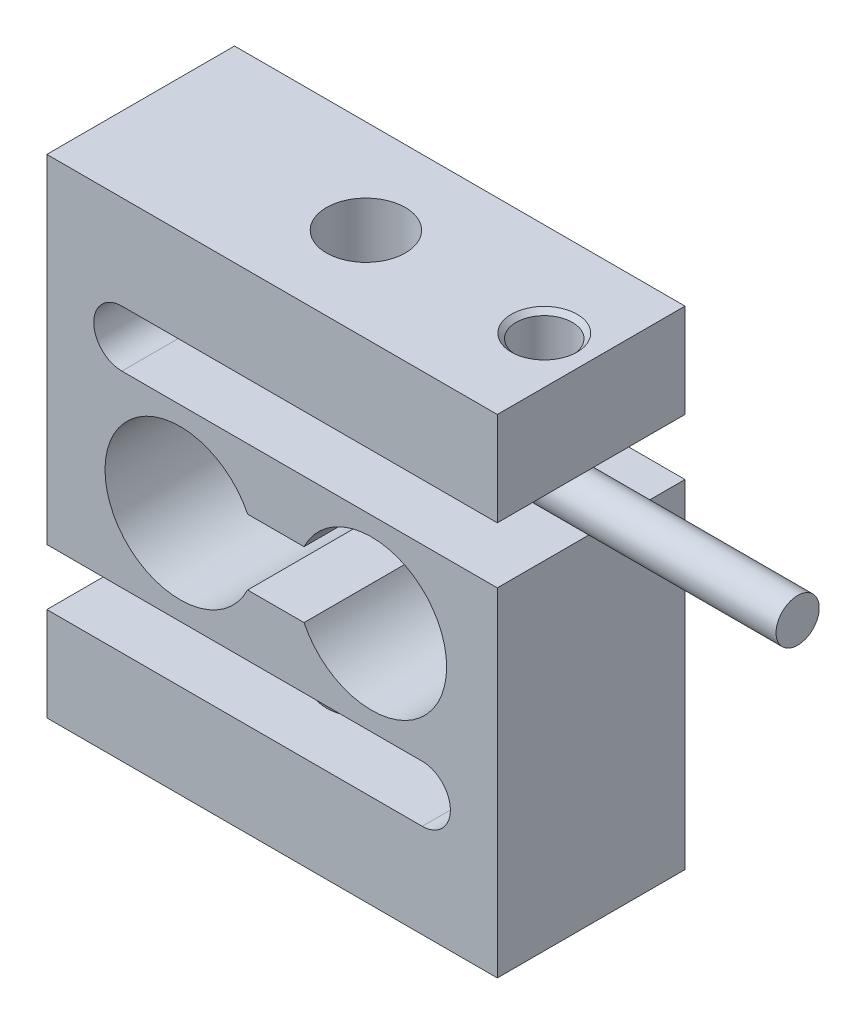
ISO-10303-21;
HEADER;
FILE_DESCRIPTION(('STEP AP214'),'2;1');
FILE_NAME('part.step','',(''),(''),'','','');
FILE_SCHEMA(('AUTOMOTIVE_DESIGN { 1 0 10303 214 1 1 1 1 }'));
ENDSEC;
DATA;
#1=APPLICATION_CONTEXT('core data for automotive mechanical design processes');
#2=APPLICATION_PROTOCOL_DEFINITION('international standard','automotive_design',2000,#1);
#3=PRODUCT_CONTEXT('',#1,'mechanical');
#4=PRODUCT('Part','Part','',(#3));
#5=PRODUCT_RELATED_PRODUCT_CATEGORY('part','',(#4));
#6=PRODUCT_DEFINITION_FORMATION('','',#4);
#7=PRODUCT_DEFINITION_CONTEXT('part definition',#1,'design');
#8=PRODUCT_DEFINITION('design','',#6,#7);
#9=PRODUCT_DEFINITION_SHAPE('','',#8);
#10=(LENGTH_UNIT() NAMED_UNIT(*) SI_UNIT(.MILLI.,.METRE.));
#11=(NAMED_UNIT(*) PLANE_ANGLE_UNIT() SI_UNIT($,.RADIAN.));
#12=(NAMED_UNIT(*) SI_UNIT($,.STERADIAN.) SOLID_ANGLE_UNIT());
#13=UNCERTAINTY_MEASURE_WITH_UNIT(LENGTH_MEASURE(1.E-05),#10,'distance_accuracy_value','');
#14=(GEOMETRIC_REPRESENTATION_CONTEXT(3) GLOBAL_UNCERTAINTY_ASSIGNED_CONTEXT((#13)) GLOBAL_UNIT_ASSIGNED_CONTEXT((#10,
#11,#12)) REPRESENTATION_CONTEXT('',''));
#15=CARTESIAN_POINT('',(0.,0.,0.));
#16=DIRECTION('',(0.,0.,1.));
#17=DIRECTION('',(1.,0.,0.));
#18=AXIS2_PLACEMENT_3D('',#15,#16,#17);
#19=CARTESIAN_POINT('',(12.,-13.,-5.));
#20=DIRECTION('',(1.,0.,0.));
#21=DIRECTION('',(0.,0.,-1.));
#22=AXIS2_PLACEMENT_3D('',#19,#20,#21);
#23=PLANE('',#22);
#24=DIRECTION('',(0.,0.,-1.));
#25=VECTOR('',#24,1.);
#26=CARTESIAN_POINT('',(12.,8.,5.));
#27=LINE('',#26,#25);
#28=CARTESIAN_POINT('',(12.,8.,5.));
#29=VERTEX_POINT('',#28);
#30=CARTESIAN_POINT('',(12.,8.,-5.));
#31=VERTEX_POINT('',#30);
#32=EDGE_CURVE('E194',#29,#31,#27,.T.);
#33=ORIENTED_EDGE('',*,*,#32,.T.);
#34=DIRECTION('',(0.,1.,0.));
#35=VECTOR('',#34,1.);
#36=CARTESIAN_POINT('',(12.,-13.,-5.));
#37=LINE('',#36,#35);
#38=CARTESIAN_POINT('',(12.,13.,-5.));
#39=VERTEX_POINT('',#38);
#40=EDGE_CURVE('E247',#31,#39,#37,.T.);
#41=ORIENTED_EDGE('',*,*,#40,.T.);
#42=DIRECTION('',(0.,0.,1.));
#43=VECTOR('',#42,1.);
#44=CARTESIAN_POINT('',(12.,13.,-5.));
#45=LINE('',#44,#43);
#46=CARTESIAN_POINT('',(12.,13.,5.));
#47=VERTEX_POINT('',#46);
#48=EDGE_CURVE('E264',#39,#47,#45,.T.);
#49=ORIENTED_EDGE('',*,*,#48,.T.);
#50=DIRECTION('',(0.,1.,0.));
#51=VECTOR('',#50,1.);
#52=CARTESIAN_POINT('',(12.,-13.,5.));
#53=LINE('',#52,#51);
#54=EDGE_CURVE('E261',#29,#47,#53,.T.);
#55=ORIENTED_EDGE('',*,*,#54,.F.);
#56=EDGE_LOOP('',(#33,#41,#49,#55));
#57=FACE_BOUND('',#56,.T.);
#58=ADVANCED_FACE('F35',(#57),#23,.T.);
#59=CARTESIAN_POINT('',(-12.,13.,-5.));
#60=DIRECTION('',(-1.,0.,0.));
#61=DIRECTION('',(0.,0.,1.));
#62=AXIS2_PLACEMENT_3D('',#59,#60,#61);
#63=PLANE('',#62);
#64=DIRECTION('',(0.,0.,-1.));
#65=VECTOR('',#64,1.);
#66=CARTESIAN_POINT('',(-12.,-8.00000000000001,5.));
#67=LINE('',#66,#65);
#68=CARTESIAN_POINT('',(-12.,-8.00000000000001,5.));
#69=VERTEX_POINT('',#68);
#70=CARTESIAN_POINT('',(-12.,-8.00000000000001,-5.));
#71=VERTEX_POINT('',#70);
#72=EDGE_CURVE('E220',#69,#71,#67,.T.);
#73=ORIENTED_EDGE('',*,*,#72,.T.);
#74=DIRECTION('',(0.,-1.,0.));
#75=VECTOR('',#74,1.);
#76=CARTESIAN_POINT('',(-12.,13.,-5.));
#77=LINE('',#76,#75);
#78=CARTESIAN_POINT('',(-12.,-13.,-5.));
#79=VERTEX_POINT('',#78);
#80=EDGE_CURVE('E239',#71,#79,#77,.T.);
#81=ORIENTED_EDGE('',*,*,#80,.T.);
#82=DIRECTION('',(0.,0.,1.));
#83=VECTOR('',#82,1.);
#84=CARTESIAN_POINT('',(-12.,-13.,-5.));
#85=LINE('',#84,#83);
#86=CARTESIAN_POINT('',(-12.,-13.,5.));
#87=VERTEX_POINT('',#86);
#88=EDGE_CURVE('E270',#79,#87,#85,.T.);
#89=ORIENTED_EDGE('',*,*,#88,.T.);
#90=DIRECTION('',(0.,-1.,0.));
#91=VECTOR('',#90,1.);
#92=CARTESIAN_POINT('',(-12.,13.,5.));
#93=LINE('',#92,#91);
#94=EDGE_CURVE('E254',#69,#87,#93,.T.);
#95=ORIENTED_EDGE('',*,*,#94,.F.);
#96=EDGE_LOOP('',(#73,#81,#89,#95));
#97=FACE_BOUND('',#96,.T.);
#98=ADVANCED_FACE('F298',(#97),#63,.T.);
#99=CARTESIAN_POINT('',(12.,13.,-5.));
#100=DIRECTION('',(0.,1.,0.));
#101=DIRECTION('',(0.,0.,1.));
#102=AXIS2_PLACEMENT_3D('',#99,#100,#101);
#103=PLANE('',#102);
#104=CARTESIAN_POINT('',(9.5,13.,0.));
#105=DIRECTION('',(0.,1.,0.));
#106=DIRECTION('',(0.,0.,1.));
#107=AXIS2_PLACEMENT_3D('',#104,#105,#106);
#108=CIRCLE('',#107,1.74999999999408);
#109=CARTESIAN_POINT('',(9.5,13.,1.74999999999408));
#110=VERTEX_POINT('',#109);
#111=EDGE_CURVE('E276',#110,#110,#108,.F.);
#112=ORIENTED_EDGE('',*,*,#111,.T.);
#113=EDGE_LOOP('',(#112));
#114=FACE_BOUND('',#113,.T.);
#115=CARTESIAN_POINT('',(0.,13.,0.));
#116=DIRECTION('',(0.,-1.,0.));
#117=DIRECTION('',(0.,0.,-1.));
#118=AXIS2_PLACEMENT_3D('',#115,#116,#117);
#119=CIRCLE('',#118,2.09999999999999);
#120=CARTESIAN_POINT('',(0.,13.,-2.09999999999999));
#121=VERTEX_POINT('',#120);
#122=EDGE_CURVE('E166',#121,#121,#119,.T.);
#123=ORIENTED_EDGE('',*,*,#122,.T.);
#124=EDGE_LOOP('',(#123));
#125=FACE_BOUND('',#124,.T.);
#126=DIRECTION('',(-1.,0.,0.));
#127=VECTOR('',#126,1.);
#128=CARTESIAN_POINT('',(12.,13.,5.));
#129=LINE('',#128,#127);
#130=CARTESIAN_POINT('',(-12.,13.,5.));
#131=VERTEX_POINT('',#130);
#132=EDGE_CURVE('E229',#47,#131,#129,.T.);
#133=ORIENTED_EDGE('',*,*,#132,.F.);
#134=ORIENTED_EDGE('',*,*,#48,.F.);
#135=DIRECTION('',(-1.,0.,0.));
#136=VECTOR('',#135,1.);
#137=CARTESIAN_POINT('',(12.,13.,-5.));
#138=LINE('',#137,#136);
#139=CARTESIAN_POINT('',(-12.,13.,-5.));
#140=VERTEX_POINT('',#139);
#141=EDGE_CURVE('E236',#39,#140,#138,.T.);
#142=ORIENTED_EDGE('',*,*,#141,.T.);
#143=DIRECTION('',(0.,0.,1.));
#144=VECTOR('',#143,1.);
#145=CARTESIAN_POINT('',(-12.,13.,-5.));
#146=LINE('',#145,#144);
#147=EDGE_CURVE('E251',#140,#131,#146,.T.);
#148=ORIENTED_EDGE('',*,*,#147,.T.);
#149=EDGE_LOOP('',(#133,#134,#142,#148));
#150=FACE_BOUND('',#149,.T.);
#151=ADVANCED_FACE('F305',(#114,#125,#150),#103,.T.);
#152=DIRECTION('',(0.,0.,-1.));
#153=VECTOR('',#152,1.);
#154=CARTESIAN_POINT('',(12.,5.,5.));
#155=LINE('',#154,#153);
#156=CARTESIAN_POINT('',(12.,5.,5.));
#157=VERTEX_POINT('',#156);
#158=CARTESIAN_POINT('',(12.,5.,-5.));
#159=VERTEX_POINT('',#158);
#160=EDGE_CURVE('E206',#157,#159,#155,.T.);
#161=ORIENTED_EDGE('',*,*,#160,.F.);
#162=CARTESIAN_POINT('',(12.,-13.,5.));
#163=VERTEX_POINT('',#162);
#164=EDGE_CURVE('E240',#163,#157,#53,.T.);
#165=ORIENTED_EDGE('',*,*,#164,.F.);
#166=DIRECTION('',(0.,0.,1.));
#167=VECTOR('',#166,1.);
#168=CARTESIAN_POINT('',(12.,-13.,-5.));
#169=LINE('',#168,#167);
#170=CARTESIAN_POINT('',(12.,-13.,-5.));
#171=VERTEX_POINT('',#170);
#172=EDGE_CURVE('E268',#171,#163,#169,.T.);
#173=ORIENTED_EDGE('',*,*,#172,.F.);
#174=EDGE_CURVE('E248',#171,#159,#37,.T.);
#175=ORIENTED_EDGE('',*,*,#174,.T.);
#176=EDGE_LOOP('',(#161,#165,#173,#175));
#177=FACE_BOUND('',#176,.T.);
#178=ADVANCED_FACE('F301',(#177),#23,.T.);
#179=CARTESIAN_POINT('',(-12.,-13.,-5.));
#180=DIRECTION('',(0.,-1.,0.));
#181=DIRECTION('',(0.,0.,-1.));
#182=AXIS2_PLACEMENT_3D('',#179,#180,#181);
#183=PLANE('',#182);
#184=CARTESIAN_POINT('',(-9.5,-13.,0.));
#185=DIRECTION('',(0.,-1.,0.));
#186=DIRECTION('',(0.,0.,-1.));
#187=AXIS2_PLACEMENT_3D('',#184,#185,#186);
#188=CIRCLE('',#187,1.74999999999408);
#189=CARTESIAN_POINT('',(-9.5,-13.,-1.74999999999408));
#190=VERTEX_POINT('',#189);
#191=EDGE_CURVE('E11',#190,#190,#188,.F.);
#192=ORIENTED_EDGE('',*,*,#191,.T.);
#193=EDGE_LOOP('',(#192));
#194=FACE_BOUND('',#193,.T.);
#195=CARTESIAN_POINT('',(0.,-13.,0.));
#196=DIRECTION('',(0.,1.,0.));
#197=DIRECTION('',(0.,0.,1.));
#198=AXIS2_PLACEMENT_3D('',#195,#196,#197);
#199=CIRCLE('',#198,2.09999999999999);
#200=CARTESIAN_POINT('',(0.,-13.,2.09999999999999));
#201=VERTEX_POINT('',#200);
#202=EDGE_CURVE('E393',#201,#201,#199,.T.);
#203=ORIENTED_EDGE('',*,*,#202,.T.);
#204=EDGE_LOOP('',(#203));
#205=FACE_BOUND('',#204,.T.);
#206=DIRECTION('',(1.,0.,0.));
#207=VECTOR('',#206,1.);
#208=CARTESIAN_POINT('',(-12.,-13.,5.));
#209=LINE('',#208,#207);
#210=EDGE_CURVE('E258',#87,#163,#209,.T.);
#211=ORIENTED_EDGE('',*,*,#210,.F.);
#212=ORIENTED_EDGE('',*,*,#88,.F.);
#213=DIRECTION('',(1.,0.,0.));
#214=VECTOR('',#213,1.);
#215=CARTESIAN_POINT('',(-12.,-13.,-5.));
#216=LINE('',#215,#214);
#217=EDGE_CURVE('E244',#79,#171,#216,.T.);
#218=ORIENTED_EDGE('',*,*,#217,.T.);
#219=ORIENTED_EDGE('',*,*,#172,.T.);
#220=EDGE_LOOP('',(#211,#212,#218,#219));
#221=FACE_BOUND('',#220,.T.);
#222=ADVANCED_FACE('F312',(#194,#205,#221),#183,.T.);
#223=DIRECTION('',(0.,0.,-1.));
#224=VECTOR('',#223,1.);
#225=CARTESIAN_POINT('',(-12.,-4.99999999999996,5.));
#226=LINE('',#225,#224);
#227=CARTESIAN_POINT('',(-12.,-4.99999999999996,5.));
#228=VERTEX_POINT('',#227);
#229=CARTESIAN_POINT('',(-12.,-4.99999999999996,-5.));
#230=VERTEX_POINT('',#229);
#231=EDGE_CURVE('E232',#228,#230,#226,.T.);
#232=ORIENTED_EDGE('',*,*,#231,.F.);
#233=EDGE_CURVE('E255',#131,#228,#93,.T.);
#234=ORIENTED_EDGE('',*,*,#233,.F.);
#235=ORIENTED_EDGE('',*,*,#147,.F.);
#236=EDGE_CURVE('E241',#140,#230,#77,.T.);
#237=ORIENTED_EDGE('',*,*,#236,.T.);
#238=EDGE_LOOP('',(#232,#234,#235,#237));
#239=FACE_BOUND('',#238,.T.);
#240=ADVANCED_FACE('F308',(#239),#63,.T.);
#241=CARTESIAN_POINT('',(0.,0.,-5.));
#242=DIRECTION('',(0.,0.,1.));
#243=DIRECTION('',(1.,0.,0.));
#244=AXIS2_PLACEMENT_3D('',#241,#242,#243);
#245=PLANE('',#244);
#246=DIRECTION('',(1.,0.,0.));
#247=VECTOR('',#246,1.);
#248=CARTESIAN_POINT('',(-1.30312635751546,1.75,-5.));
#249=LINE('',#248,#247);
#250=CARTESIAN_POINT('',(-1.30312635751546,1.75,-5.));
#251=VERTEX_POINT('',#250);
#252=CARTESIAN_POINT('',(1.70312635751546,1.75,-5.));
#253=VERTEX_POINT('',#252);
#254=EDGE_CURVE('E173',#251,#253,#249,.T.);
#255=ORIENTED_EDGE('',*,*,#254,.F.);
#256=CARTESIAN_POINT('',(-4.9,0.,-5.));
#257=DIRECTION('',(0.,0.,1.));
#258=DIRECTION('',(1.,0.,0.));
#259=AXIS2_PLACEMENT_3D('',#256,#257,#258);
#260=CIRCLE('',#259,4.);
#261=CARTESIAN_POINT('',(-1.30312635751546,-1.75,-5.));
#262=VERTEX_POINT('',#261);
#263=EDGE_CURVE('E149',#251,#262,#260,.T.);
#264=ORIENTED_EDGE('',*,*,#263,.T.);
#265=DIRECTION('',(-1.,0.,0.));
#266=VECTOR('',#265,1.);
#267=CARTESIAN_POINT('',(1.70312635751546,-1.75,-5.));
#268=LINE('',#267,#266);
#269=CARTESIAN_POINT('',(1.70312635751546,-1.75,-5.));
#270=VERTEX_POINT('',#269);
#271=EDGE_CURVE('E177',#270,#262,#268,.T.);
#272=ORIENTED_EDGE('',*,*,#271,.F.);
#273=CARTESIAN_POINT('',(5.3,0.,-5.));
#274=DIRECTION('',(0.,0.,1.));
#275=DIRECTION('',(1.,0.,0.));
#276=AXIS2_PLACEMENT_3D('',#273,#274,#275);
#277=CIRCLE('',#276,4.);
#278=EDGE_CURVE('E50',#270,#253,#277,.T.);
#279=ORIENTED_EDGE('',*,*,#278,.T.);
#280=EDGE_LOOP('',(#255,#264,#272,#279));
#281=FACE_BOUND('',#280,.T.);
#282=ORIENTED_EDGE('',*,*,#40,.F.);
#283=DIRECTION('',(1.,0.,0.));
#284=VECTOR('',#283,1.);
#285=CARTESIAN_POINT('',(-8.,8.,-5.));
#286=LINE('',#285,#284);
#287=CARTESIAN_POINT('',(-8.,8.,-5.));
#288=VERTEX_POINT('',#287);
#289=EDGE_CURVE('E181',#288,#31,#286,.T.);
#290=ORIENTED_EDGE('',*,*,#289,.F.);
#291=CARTESIAN_POINT('',(-8.,6.5,-5.));
#292=DIRECTION('',(0.,0.,-1.));
#293=DIRECTION('',(-1.,0.,0.));
#294=AXIS2_PLACEMENT_3D('',#291,#292,#293);
#295=CIRCLE('',#294,1.5);
#296=CARTESIAN_POINT('',(-8.,5.,-5.));
#297=VERTEX_POINT('',#296);
#298=EDGE_CURVE('E188',#297,#288,#295,.T.);
#299=ORIENTED_EDGE('',*,*,#298,.F.);
#300=DIRECTION('',(-1.,0.,0.));
#301=VECTOR('',#300,1.);
#302=CARTESIAN_POINT('',(12.,5.,-5.));
#303=LINE('',#302,#301);
#304=EDGE_CURVE('E196',#159,#297,#303,.T.);
#305=ORIENTED_EDGE('',*,*,#304,.F.);
#306=ORIENTED_EDGE('',*,*,#174,.F.);
#307=ORIENTED_EDGE('',*,*,#217,.F.);
#308=ORIENTED_EDGE('',*,*,#80,.F.);
#309=DIRECTION('',(-1.,0.,0.));
#310=VECTOR('',#309,1.);
#311=CARTESIAN_POINT('',(7.99999999999998,-8.00000000000003,-5.));
#312=LINE('',#311,#310);
#313=CARTESIAN_POINT('',(7.99999999999998,-8.00000000000005,-5.));
#314=VERTEX_POINT('',#313);
#315=EDGE_CURVE('E203',#314,#71,#312,.T.);
#316=ORIENTED_EDGE('',*,*,#315,.F.);
#317=CARTESIAN_POINT('',(7.99999999999998,-6.50000000000003,-5.));
#318=DIRECTION('',(0.,0.,-1.));
#319=DIRECTION('',(-1.,0.,0.));
#320=AXIS2_PLACEMENT_3D('',#317,#318,#319);
#321=CIRCLE('',#320,1.50000000000002);
#322=CARTESIAN_POINT('',(7.99999999999998,-5.,-5.));
#323=VERTEX_POINT('',#322);
#324=EDGE_CURVE('E214',#323,#314,#321,.T.);
#325=ORIENTED_EDGE('',*,*,#324,.F.);
#326=DIRECTION('',(1.,0.,0.));
#327=VECTOR('',#326,1.);
#328=CARTESIAN_POINT('',(-12.,-4.99999999999996,-5.));
#329=LINE('',#328,#327);
#330=EDGE_CURVE('E222',#230,#323,#329,.T.);
#331=ORIENTED_EDGE('',*,*,#330,.F.);
#332=ORIENTED_EDGE('',*,*,#236,.F.);
#333=ORIENTED_EDGE('',*,*,#141,.F.);
#334=EDGE_LOOP('',(#282,#290,#299,#305,#306,#307,#308,#316,#325,#331,#332,#333));
#335=FACE_BOUND('',#334,.T.);
#336=ADVANCED_FACE('F334',(#281,#335),#245,.F.);
#337=CARTESIAN_POINT('',(0.,0.,5.));
#338=DIRECTION('',(0.,0.,1.));
#339=DIRECTION('',(1.,0.,0.));
#340=AXIS2_PLACEMENT_3D('',#337,#338,#339);
#341=PLANE('',#340);
#342=CARTESIAN_POINT('',(-4.9,0.,5.));
#343=DIRECTION('',(0.,0.,1.));
#344=DIRECTION('',(1.,0.,0.));
#345=AXIS2_PLACEMENT_3D('',#342,#343,#344);
#346=CIRCLE('',#345,4.);
#347=CARTESIAN_POINT('',(-1.30312635751546,1.75,5.));
#348=VERTEX_POINT('',#347);
#349=CARTESIAN_POINT('',(-1.30312635751546,-1.75,5.));
#350=VERTEX_POINT('',#349);
#351=EDGE_CURVE('E58',#348,#350,#346,.T.);
#352=ORIENTED_EDGE('',*,*,#351,.F.);
#353=DIRECTION('',(1.,0.,0.));
#354=VECTOR('',#353,1.);
#355=CARTESIAN_POINT('',(-1.30312635751546,1.75,5.));
#356=LINE('',#355,#354);
#357=CARTESIAN_POINT('',(1.70312635751546,1.75,5.));
#358=VERTEX_POINT('',#357);
#359=EDGE_CURVE('E163',#348,#358,#356,.T.);
#360=ORIENTED_EDGE('',*,*,#359,.T.);
#361=CARTESIAN_POINT('',(5.3,0.,5.));
#362=DIRECTION('',(0.,0.,1.));
#363=DIRECTION('',(1.,0.,0.));
#364=AXIS2_PLACEMENT_3D('',#361,#362,#363);
#365=CIRCLE('',#364,4.);
#366=CARTESIAN_POINT('',(1.70312635751546,-1.75,5.));
#367=VERTEX_POINT('',#366);
#368=EDGE_CURVE('E381',#367,#358,#365,.T.);
#369=ORIENTED_EDGE('',*,*,#368,.F.);
#370=DIRECTION('',(-1.,0.,0.));
#371=VECTOR('',#370,1.);
#372=CARTESIAN_POINT('',(1.70312635751546,-1.75,5.));
#373=LINE('',#372,#371);
#374=EDGE_CURVE('E165',#367,#350,#373,.T.);
#375=ORIENTED_EDGE('',*,*,#374,.T.);
#376=EDGE_LOOP('',(#352,#360,#369,#375));
#377=FACE_BOUND('',#376,.T.);
#378=DIRECTION('',(1.,0.,0.));
#379=VECTOR('',#378,1.);
#380=CARTESIAN_POINT('',(-8.,8.,5.));
#381=LINE('',#380,#379);
#382=CARTESIAN_POINT('',(-8.,8.,5.));
#383=VERTEX_POINT('',#382);
#384=EDGE_CURVE('E184',#383,#29,#381,.T.);
#385=ORIENTED_EDGE('',*,*,#384,.T.);
#386=ORIENTED_EDGE('',*,*,#54,.T.);
#387=ORIENTED_EDGE('',*,*,#132,.T.);
#388=ORIENTED_EDGE('',*,*,#233,.T.);
#389=DIRECTION('',(1.,0.,0.));
#390=VECTOR('',#389,1.);
#391=CARTESIAN_POINT('',(-12.,-4.99999999999996,5.));
#392=LINE('',#391,#390);
#393=CARTESIAN_POINT('',(7.99999999999998,-5.,5.));
#394=VERTEX_POINT('',#393);
#395=EDGE_CURVE('E213',#228,#394,#392,.T.);
#396=ORIENTED_EDGE('',*,*,#395,.T.);
#397=CARTESIAN_POINT('',(7.99999999999998,-6.50000000000003,5.));
#398=DIRECTION('',(0.,0.,-1.));
#399=DIRECTION('',(-1.,0.,0.));
#400=AXIS2_PLACEMENT_3D('',#397,#398,#399);
#401=CIRCLE('',#400,1.50000000000002);
#402=CARTESIAN_POINT('',(7.99999999999998,-8.00000000000005,5.));
#403=VERTEX_POINT('',#402);
#404=EDGE_CURVE('E217',#394,#403,#401,.T.);
#405=ORIENTED_EDGE('',*,*,#404,.T.);
#406=DIRECTION('',(-1.,0.,0.));
#407=VECTOR('',#406,1.);
#408=CARTESIAN_POINT('',(7.99999999999998,-8.00000000000003,5.));
#409=LINE('',#408,#407);
#410=EDGE_CURVE('E210',#403,#69,#409,.T.);
#411=ORIENTED_EDGE('',*,*,#410,.T.);
#412=ORIENTED_EDGE('',*,*,#94,.T.);
#413=ORIENTED_EDGE('',*,*,#210,.T.);
#414=ORIENTED_EDGE('',*,*,#164,.T.);
#415=DIRECTION('',(-1.,0.,0.));
#416=VECTOR('',#415,1.);
#417=CARTESIAN_POINT('',(12.,5.,5.));
#418=LINE('',#417,#416);
#419=CARTESIAN_POINT('',(-8.,5.,5.));
#420=VERTEX_POINT('',#419);
#421=EDGE_CURVE('E187',#157,#420,#418,.T.);
#422=ORIENTED_EDGE('',*,*,#421,.T.);
#423=CARTESIAN_POINT('',(-8.,6.5,5.));
#424=DIRECTION('',(0.,0.,-1.));
#425=DIRECTION('',(-1.,0.,0.));
#426=AXIS2_PLACEMENT_3D('',#423,#424,#425);
#427=CIRCLE('',#426,1.5);
#428=EDGE_CURVE('E191',#420,#383,#427,.T.);
#429=ORIENTED_EDGE('',*,*,#428,.T.);
#430=EDGE_LOOP('',(#385,#386,#387,#388,#396,#405,#411,#412,#413,#414,#422,#429));
#431=FACE_BOUND('',#430,.T.);
#432=ADVANCED_FACE('F160',(#377,#431),#341,.T.);
#433=CARTESIAN_POINT('',(7.99999999999998,-8.00000000000003,5.));
#434=DIRECTION('',(0.,-1.,0.));
#435=DIRECTION('',(1.,0.,0.));
#436=AXIS2_PLACEMENT_3D('',#433,#434,#435);
#437=PLANE('',#436);
#438=CARTESIAN_POINT('',(-9.5,-8.00000000000001,0.));
#439=DIRECTION('',(0.,-1.,0.));
#440=DIRECTION('',(1.,0.,0.));
#441=AXIS2_PLACEMENT_3D('',#438,#439,#440);
#442=CIRCLE('',#441,1.49999999999999);
#443=CARTESIAN_POINT('',(-8.00000000000001,-8.00000000000001,0.));
#444=VERTEX_POINT('',#443);
#445=EDGE_CURVE('E399',#444,#444,#442,.T.);
#446=ORIENTED_EDGE('',*,*,#445,.T.);
#447=EDGE_LOOP('',(#446));
#448=FACE_BOUND('',#447,.T.);
#449=CARTESIAN_POINT('',(0.,-8.00000000000002,0.));
#450=DIRECTION('',(0.,1.,0.));
#451=DIRECTION('',(0.,0.,1.));
#452=AXIS2_PLACEMENT_3D('',#449,#450,#451);
#453=CIRCLE('',#452,2.09999999999999);
#454=CARTESIAN_POINT('',(0.,-8.00000000000002,2.09999999999999));
#455=VERTEX_POINT('',#454);
#456=EDGE_CURVE('E396',#455,#455,#453,.T.);
#457=ORIENTED_EDGE('',*,*,#456,.F.);
#458=EDGE_LOOP('',(#457));
#459=FACE_BOUND('',#458,.T.);
#460=ORIENTED_EDGE('',*,*,#315,.T.);
#461=ORIENTED_EDGE('',*,*,#72,.F.);
#462=ORIENTED_EDGE('',*,*,#410,.F.);
#463=DIRECTION('',(0.,0.,-1.));
#464=VECTOR('',#463,1.);
#465=CARTESIAN_POINT('',(7.99999999999998,-8.00000000000005,5.));
#466=LINE('',#465,#464);
#467=EDGE_CURVE('E227',#403,#314,#466,.T.);
#468=ORIENTED_EDGE('',*,*,#467,.T.);
#469=EDGE_LOOP('',(#460,#461,#462,#468));
#470=FACE_BOUND('',#469,.T.);
#471=ADVANCED_FACE('F362',(#448,#459,#470),#437,.F.);
#472=CARTESIAN_POINT('',(7.99999999999998,-6.50000000000003,5.));
#473=DIRECTION('',(0.,0.,-1.));
#474=DIRECTION('',(-1.,0.,0.));
#475=AXIS2_PLACEMENT_3D('',#472,#473,#474);
#476=CYLINDRICAL_SURFACE('',#475,1.50000000000002);
#477=ORIENTED_EDGE('',*,*,#324,.T.);
#478=ORIENTED_EDGE('',*,*,#467,.F.);
#479=ORIENTED_EDGE('',*,*,#404,.F.);
#480=DIRECTION('',(0.,0.,-1.));
#481=VECTOR('',#480,1.);
#482=CARTESIAN_POINT('',(7.99999999999998,-5.,5.));
#483=LINE('',#482,#481);
#484=EDGE_CURVE('E230',#394,#323,#483,.T.);
#485=ORIENTED_EDGE('',*,*,#484,.T.);
#486=EDGE_LOOP('',(#477,#478,#479,#485));
#487=FACE_BOUND('',#486,.T.);
#488=ADVANCED_FACE('F359',(#487),#476,.F.);
#489=CARTESIAN_POINT('',(-12.,-4.99999999999996,5.));
#490=DIRECTION('',(0.,1.,0.));
#491=DIRECTION('',(-1.,0.,0.));
#492=AXIS2_PLACEMENT_3D('',#489,#490,#491);
#493=PLANE('',#492);
#494=ORIENTED_EDGE('',*,*,#330,.T.);
#495=ORIENTED_EDGE('',*,*,#484,.F.);
#496=ORIENTED_EDGE('',*,*,#395,.F.);
#497=ORIENTED_EDGE('',*,*,#231,.T.);
#498=EDGE_LOOP('',(#494,#495,#496,#497));
#499=FACE_BOUND('',#498,.T.);
#500=ADVANCED_FACE('F354',(#499),#493,.F.);
#501=CARTESIAN_POINT('',(-8.,8.,5.));
#502=DIRECTION('',(0.,1.,0.));
#503=DIRECTION('',(0.,0.,1.));
#504=AXIS2_PLACEMENT_3D('',#501,#502,#503);
#505=PLANE('',#504);
#506=CARTESIAN_POINT('',(9.5,8.,0.));
#507=DIRECTION('',(0.,1.,0.));
#508=DIRECTION('',(0.,0.,1.));
#509=AXIS2_PLACEMENT_3D('',#506,#507,#508);
#510=CIRCLE('',#509,1.49999999999999);
#511=CARTESIAN_POINT('',(9.5,8.,1.5));
#512=VERTEX_POINT('',#511);
#513=EDGE_CURVE('E390',#512,#512,#510,.T.);
#514=ORIENTED_EDGE('',*,*,#513,.T.);
#515=EDGE_LOOP('',(#514));
#516=FACE_BOUND('',#515,.T.);
#517=CARTESIAN_POINT('',(0.,8.,0.));
#518=DIRECTION('',(0.,-1.,0.));
#519=DIRECTION('',(0.,0.,-1.));
#520=AXIS2_PLACEMENT_3D('',#517,#518,#519);
#521=CIRCLE('',#520,2.09999999999999);
#522=CARTESIAN_POINT('',(0.,8.,-2.09999999999999));
#523=VERTEX_POINT('',#522);
#524=EDGE_CURVE('E387',#523,#523,#521,.T.);
#525=ORIENTED_EDGE('',*,*,#524,.F.);
#526=EDGE_LOOP('',(#525));
#527=FACE_BOUND('',#526,.T.);
#528=ORIENTED_EDGE('',*,*,#289,.T.);
#529=ORIENTED_EDGE('',*,*,#32,.F.);
#530=ORIENTED_EDGE('',*,*,#384,.F.);
#531=DIRECTION('',(0.,0.,-1.));
#532=VECTOR('',#531,1.);
#533=CARTESIAN_POINT('',(-8.,8.,5.));
#534=LINE('',#533,#532);
#535=EDGE_CURVE('E201',#383,#288,#534,.T.);
#536=ORIENTED_EDGE('',*,*,#535,.T.);
#537=EDGE_LOOP('',(#528,#529,#530,#536));
#538=FACE_BOUND('',#537,.T.);
#539=ADVANCED_FACE('F509',(#516,#527,#538),#505,.F.);
#540=CARTESIAN_POINT('',(-8.,6.5,5.));
#541=DIRECTION('',(0.,0.,-1.));
#542=DIRECTION('',(-1.,0.,0.));
#543=AXIS2_PLACEMENT_3D('',#540,#541,#542);
#544=CYLINDRICAL_SURFACE('',#543,1.5);
#545=CARTESIAN_POINT('',(-9.5,6.5,1.14999999999999));
#546=CARTESIAN_POINT('',(-9.49999555215586,6.55586244272782,1.14999538973257));
#547=CARTESIAN_POINT('',(-9.49684830412459,6.61178377168893,1.14589838364212));
#548=CARTESIAN_POINT('',(-9.48454420823457,6.72183087371638,1.12977762751347));
#549=CARTESIAN_POINT('',(-9.47537710520092,6.77595341684933,1.11774035060177));
#550=CARTESIAN_POINT('',(-9.45190960963095,6.88054682629625,1.08657530647751));
#551=CARTESIAN_POINT('',(-9.43763942486179,6.93103712451209,1.067489243332));
#552=CARTESIAN_POINT('',(-9.40502275376107,7.02774947212164,1.0231394328075));
#553=CARTESIAN_POINT('',(-9.38667659316262,7.07397186216919,0.997876179064759));
#554=CARTESIAN_POINT('',(-9.34518538198387,7.16576614867274,0.939408947884147));
#555=CARTESIAN_POINT('',(-9.32175193668701,7.21087255667463,0.90568317002841));
#556=CARTESIAN_POINT('',(-9.27283704659413,7.29515135419278,0.8326758241433));
#557=CARTESIAN_POINT('',(-9.24735264803337,7.33431494210418,0.793386178956241));
#558=CARTESIAN_POINT('',(-9.19045522474408,7.41416405712968,0.70092348863787));
#559=CARTESIAN_POINT('',(-9.15893079307119,7.45341178563546,0.646573048326008));
#560=CARTESIAN_POINT('',(-9.09853582937581,7.52240310353357,0.530778019971598));
#561=CARTESIAN_POINT('',(-9.06966214721833,7.55215808097941,0.469342053578323));
#562=CARTESIAN_POINT('',(-9.02828894352203,7.59231054490262,0.362439970425284));
#563=CARTESIAN_POINT('',(-9.01360889451369,7.60583281414093,0.319003090072164));
#564=CARTESIAN_POINT('',(-8.98912436561423,7.62778745012391,0.229577394463995));
#565=CARTESIAN_POINT('',(-8.97930846687069,7.63623174773416,0.183594840415369));
#566=CARTESIAN_POINT('',(-8.96608976787453,7.64749894151293,0.0894879914862548));
#567=CARTESIAN_POINT('',(-8.96275444247723,7.65026270974255,0.0413464467634098));
#568=CARTESIAN_POINT('',(-8.96342895705935,7.64969761845789,-0.0548552830197285));
#569=CARTESIAN_POINT('',(-8.96743967885713,7.64636802749774,-0.102915457619191));
#570=CARTESIAN_POINT('',(-8.98104811543695,7.63472791375893,-0.191419302929286));
#571=CARTESIAN_POINT('',(-8.9899011168376,7.6270776264311,-0.232074715865842));
#572=CARTESIAN_POINT('',(-9.01143355361504,7.60779587070725,-0.311377633424956));
#573=CARTESIAN_POINT('',(-9.02411707954014,7.59616014454211,-0.350022939517908));
#574=CARTESIAN_POINT('',(-9.06122726919038,7.56057110626883,-0.449469841904463));
#575=CARTESIAN_POINT('',(-9.08792332601177,7.53353033665499,-0.508316681534697));
#576=CARTESIAN_POINT('',(-9.14423143324666,7.47083619329217,-0.619741325462177));
#577=CARTESIAN_POINT('',(-9.17385074854484,7.43516102502789,-0.672302754705751));
#578=CARTESIAN_POINT('',(-9.23393820149296,7.35440736242003,-0.772497814644723));
#579=CARTESIAN_POINT('',(-9.26440360125785,7.3090674585666,-0.81992337015954));
#580=CARTESIAN_POINT('',(-9.32255591702186,7.21002453259215,-0.907027574089786));
#581=CARTESIAN_POINT('',(-9.35024777729517,7.15633684427996,-0.946720131698199));
#582=CARTESIAN_POINT('',(-9.39577969119053,7.0517472877029,-1.01049454456971));
#583=CARTESIAN_POINT('',(-9.41449465931392,7.0021638023238,-1.03610569961669));
#584=CARTESIAN_POINT('',(-9.44713303027248,6.89843986966343,-1.08023856181196));
#585=CARTESIAN_POINT('',(-9.46105916833318,6.84430204574189,-1.09876431659362));
#586=CARTESIAN_POINT('',(-9.48300608145692,6.73230865663959,-1.12778462842033));
#587=CARTESIAN_POINT('',(-9.4909852249784,6.67442990870803,-1.13822258714301));
#588=CARTESIAN_POINT('',(-9.5000571301718,6.55722854510334,-1.15008123202714));
#589=CARTESIAN_POINT('',(-9.50115403048097,6.49790681871766,-1.15150733747068));
#590=CARTESIAN_POINT('',(-9.49663672010638,6.38679449968355,-1.14561038288262));
#591=CARTESIAN_POINT('',(-9.49177337405452,6.33491635239394,-1.13926626353617));
#592=CARTESIAN_POINT('',(-9.47697673664939,6.23320081563546,-1.11982143279916));
#593=CARTESIAN_POINT('',(-9.46704256037765,6.18336378400523,-1.10671954209521));
#594=CARTESIAN_POINT('',(-9.44260035870547,6.08589744009979,-1.07411102413269));
#595=CARTESIAN_POINT('',(-9.42800608392055,6.0383309610608,-1.05448330840193));
#596=CARTESIAN_POINT('',(-9.39527145129807,5.94722142557359,-1.0097104908579));
#597=CARTESIAN_POINT('',(-9.37713051977161,5.90367902171934,-0.984564496355634));
#598=CARTESIAN_POINT('',(-9.33515437062761,5.81430499555045,-0.92501668131836));
#599=CARTESIAN_POINT('',(-9.3108727602934,5.76924466540902,-0.889775403038214));
#600=CARTESIAN_POINT('',(-9.26042262445491,5.68529745301153,-0.813621190838629));
#601=CARTESIAN_POINT('',(-9.23425063731429,5.64642233629917,-0.772697718588309));
#602=CARTESIAN_POINT('',(-9.17634576838792,5.56777130882171,-0.676795859272354));
#603=CARTESIAN_POINT('',(-9.144570420325,5.5294375873573,-0.620654785531734));
#604=CARTESIAN_POINT('',(-9.08441021367131,5.46266665401176,-0.501109302047999));
#605=CARTESIAN_POINT('',(-9.05601894652886,5.43421053457249,-0.437719081364966));
#606=CARTESIAN_POINT('',(-9.01704471515226,5.39725225446361,-0.329201785610705));
#607=CARTESIAN_POINT('',(-9.00378741311892,5.38527365341969,-0.286233090968624));
#608=CARTESIAN_POINT('',(-8.98229427825341,5.36628699677463,-0.198040101717645));
#609=CARTESIAN_POINT('',(-8.97404624028333,5.35926685296222,-0.152821582350248));
#610=CARTESIAN_POINT('',(-8.96389169723617,5.35066837711346,-0.0607279522317042));
#611=CARTESIAN_POINT('',(-8.96203974819039,5.34913685665643,-0.0138420196764043));
#612=CARTESIAN_POINT('',(-8.96521653838272,5.35180176904759,0.0795443977156673));
#613=CARTESIAN_POINT('',(-8.97025020340268,5.35600230244671,0.126044582649945));
#614=CARTESIAN_POINT('',(-8.98720059184047,5.37058907176213,0.222733514878418));
#615=CARTESIAN_POINT('',(-8.99988531831921,5.38167035497556,0.272675819945574));
#616=CARTESIAN_POINT('',(-9.03040160056374,5.40972487912985,0.36924711138595));
#617=CARTESIAN_POINT('',(-9.04824673465087,5.42671368844173,0.415866946807197));
#618=CARTESIAN_POINT('',(-9.094947323886,5.47403784064283,0.524117993925068));
#619=CARTESIAN_POINT('',(-9.12529912698539,5.50698618498101,0.583952586178833));
#620=CARTESIAN_POINT('',(-9.18756887525858,5.58234858055201,0.696421721371026));
#621=CARTESIAN_POINT('',(-9.21948879507218,5.62477481814014,0.7490468528229));
#622=CARTESIAN_POINT('',(-9.28234768236892,5.71968428397053,0.847570201420998));
#623=CARTESIAN_POINT('',(-9.31325462753127,5.77235032694114,0.893314258740237));
#624=CARTESIAN_POINT('',(-9.37039770325736,5.88675062673456,0.975372406407598));
#625=CARTESIAN_POINT('',(-9.39664401037306,5.94846457531306,1.01170712374871));
#626=CARTESIAN_POINT('',(-9.43556973864091,6.06213797883834,1.06470053723409));
#627=CARTESIAN_POINT('',(-9.44999957678979,6.1122614348444,1.08402283316911));
#628=CARTESIAN_POINT('',(-9.47377731002692,6.21577964156347,1.11562970156047));
#629=CARTESIAN_POINT('',(-9.4831366653745,6.26916670912996,1.12793014814928));
#630=CARTESIAN_POINT('',(-9.49302087555956,6.35251865659805,1.14088502043002));
#631=CARTESIAN_POINT('',(-9.49562999646049,6.38184104106778,1.14429510274916));
#632=CARTESIAN_POINT('',(-9.49912094086559,6.44077005387362,1.14885408048734));
#633=CARTESIAN_POINT('',(-9.50000235864392,6.47037674733558,1.15000244477522));
#634=CARTESIAN_POINT('',(-9.5,6.5,1.14999999999999));
#635=B_SPLINE_CURVE_WITH_KNOTS('',3,(#545,#546,#547,#548,#549,#550,#551,#552,#553,#554,#555,
#556,#557,#558,#559,#560,#561,#562,#563,#564,#565,#566,#567,#568,#569,#570,#571,#572,#573,#574,
#575,#576,#577,#578,#579,#580,#581,#582,#583,#584,#585,#586,#587,#588,#589,#590,#591,#592,#593,
#594,#595,#596,#597,#598,#599,#600,#601,#602,#603,#604,#605,#606,#607,#608,#609,#610,#611,#612,
#613,#614,#615,#616,#617,#618,#619,#620,#621,#622,#623,#624,#625,#626,#627,#628,#629,#630,#631,
#632,#633,#634),.UNSPECIFIED.,.T.,.F.,(4,2,2,2,2,2,2,2,2,2,2,2,2,2,2,2,2,2,2,2,2,2,2,2,2,2,2,2,
2,2,2,2,2,2,2,2,2,2,2,2,2,2,2,2,4),(0.,0.167461132274352,0.335208287038588,0.501978464755337,
0.668735319762503,0.851094337075816,1.0337208548286,1.25506760159806,1.47614780068099,
1.61909706892461,1.76170914727849,1.90579829056613,2.04990473142591,2.17635548250098,
2.30294174842333,2.51193829060554,2.72146797637443,2.93761552362214,3.15337062647135,
3.32925782890724,3.50504440271962,3.68205028938987,3.85894972335212,4.0156811626467,
4.17243996274452,4.33228690787215,4.49215973044133,4.67792408564495,4.86403768370705,
5.0882193858242,5.31196956512509,5.45110898524983,5.58990801585039,5.72988806051927,
5.86996829550822,6.02721740564322,6.18488410208389,6.4079640953147,6.63133258522074,
6.85913228148222,7.08642828899512,7.25263720605899,7.41846887513174,7.50725086613394,
7.59605370379364),.UNSPECIFIED.);
#636=CARTESIAN_POINT('',(-9.5,6.5,1.14999999999999));
#637=VERTEX_POINT('',#636);
#638=EDGE_CURVE('E401',#637,#637,#635,.T.);
#639=ORIENTED_EDGE('',*,*,#638,.T.);
#640=EDGE_LOOP('',(#639));
#641=FACE_BOUND('',#640,.T.);
#642=ORIENTED_EDGE('',*,*,#298,.T.);
#643=ORIENTED_EDGE('',*,*,#535,.F.);
#644=ORIENTED_EDGE('',*,*,#428,.F.);
#645=DIRECTION('',(0.,0.,-1.));
#646=VECTOR('',#645,1.);
#647=CARTESIAN_POINT('',(-8.,5.,5.));
#648=LINE('',#647,#646);
#649=EDGE_CURVE('E204',#420,#297,#648,.T.);
#650=ORIENTED_EDGE('',*,*,#649,.T.);
#651=EDGE_LOOP('',(#642,#643,#644,#650));
#652=FACE_BOUND('',#651,.T.);
#653=ADVANCED_FACE('F340',(#641,#652),#544,.F.);
#654=CARTESIAN_POINT('',(12.,5.,5.));
#655=DIRECTION('',(0.,-1.,0.));
#656=DIRECTION('',(1.,0.,0.));
#657=AXIS2_PLACEMENT_3D('',#654,#655,#656);
#658=PLANE('',#657);
#659=ORIENTED_EDGE('',*,*,#304,.T.);
#660=ORIENTED_EDGE('',*,*,#649,.F.);
#661=ORIENTED_EDGE('',*,*,#421,.F.);
#662=ORIENTED_EDGE('',*,*,#160,.T.);
#663=EDGE_LOOP('',(#659,#660,#661,#662));
#664=FACE_BOUND('',#663,.T.);
#665=ADVANCED_FACE('F338',(#664),#658,.F.);
#666=CARTESIAN_POINT('',(-1.30312635751546,1.75,5.));
#667=DIRECTION('',(0.,1.,0.));
#668=DIRECTION('',(-1.,0.,0.));
#669=AXIS2_PLACEMENT_3D('',#666,#667,#668);
#670=PLANE('',#669);
#671=ORIENTED_EDGE('',*,*,#254,.T.);
#672=DIRECTION('',(0.,0.,-1.));
#673=VECTOR('',#672,1.);
#674=CARTESIAN_POINT('',(1.70312635751546,1.75,5.));
#675=LINE('',#674,#673);
#676=EDGE_CURVE('E154',#358,#253,#675,.T.);
#677=ORIENTED_EDGE('',*,*,#676,.F.);
#678=ORIENTED_EDGE('',*,*,#359,.F.);
#679=DIRECTION('',(0.,0.,-1.));
#680=VECTOR('',#679,1.);
#681=CARTESIAN_POINT('',(-1.30312635751546,1.75,5.));
#682=LINE('',#681,#680);
#683=EDGE_CURVE('E146',#348,#251,#682,.T.);
#684=ORIENTED_EDGE('',*,*,#683,.T.);
#685=EDGE_LOOP('',(#671,#677,#678,#684));
#686=FACE_BOUND('',#685,.T.);
#687=ADVANCED_FACE('F169',(#686),#670,.F.);
#688=CARTESIAN_POINT('',(1.70312635751546,-1.75,5.));
#689=DIRECTION('',(0.,-1.,0.));
#690=DIRECTION('',(1.,0.,0.));
#691=AXIS2_PLACEMENT_3D('',#688,#689,#690);
#692=PLANE('',#691);
#693=ORIENTED_EDGE('',*,*,#271,.T.);
#694=DIRECTION('',(0.,0.,-1.));
#695=VECTOR('',#694,1.);
#696=CARTESIAN_POINT('',(-1.30312635751546,-1.75,5.));
#697=LINE('',#696,#695);
#698=EDGE_CURVE('E155',#350,#262,#697,.T.);
#699=ORIENTED_EDGE('',*,*,#698,.F.);
#700=ORIENTED_EDGE('',*,*,#374,.F.);
#701=DIRECTION('',(0.,0.,-1.));
#702=VECTOR('',#701,1.);
#703=CARTESIAN_POINT('',(1.70312635751546,-1.75,5.));
#704=LINE('',#703,#702);
#705=EDGE_CURVE('E170',#367,#270,#704,.T.);
#706=ORIENTED_EDGE('',*,*,#705,.T.);
#707=EDGE_LOOP('',(#693,#699,#700,#706));
#708=FACE_BOUND('',#707,.T.);
#709=ADVANCED_FACE('F434',(#708),#692,.F.);
#710=CARTESIAN_POINT('',(5.3,0.,-5.));
#711=DIRECTION('',(0.,0.,1.));
#712=DIRECTION('',(1.,0.,0.));
#713=AXIS2_PLACEMENT_3D('',#710,#711,#712);
#714=CYLINDRICAL_SURFACE('',#713,4.);
#715=ORIENTED_EDGE('',*,*,#278,.F.);
#716=ORIENTED_EDGE('',*,*,#705,.F.);
#717=ORIENTED_EDGE('',*,*,#368,.T.);
#718=ORIENTED_EDGE('',*,*,#676,.T.);
#719=EDGE_LOOP('',(#715,#716,#717,#718));
#720=FACE_BOUND('',#719,.T.);
#721=ADVANCED_FACE('F431',(#720),#714,.F.);
#722=CARTESIAN_POINT('',(-4.9,0.,-5.));
#723=DIRECTION('',(0.,0.,1.));
#724=DIRECTION('',(1.,0.,0.));
#725=AXIS2_PLACEMENT_3D('',#722,#723,#724);
#726=CYLINDRICAL_SURFACE('',#725,4.);
#727=ORIENTED_EDGE('',*,*,#351,.T.);
#728=ORIENTED_EDGE('',*,*,#698,.T.);
#729=ORIENTED_EDGE('',*,*,#263,.F.);
#730=ORIENTED_EDGE('',*,*,#683,.F.);
#731=EDGE_LOOP('',(#727,#728,#729,#730));
#732=FACE_BOUND('',#731,.T.);
#733=ADVANCED_FACE('F147',(#732),#726,.F.);
#734=CARTESIAN_POINT('',(0.,8.,0.));
#735=DIRECTION('',(0.,-1.,0.));
#736=DIRECTION('',(0.,0.,-1.));
#737=AXIS2_PLACEMENT_3D('',#734,#735,#736);
#738=CYLINDRICAL_SURFACE('',#737,2.09999999999999);
#739=ORIENTED_EDGE('',*,*,#122,.F.);
#740=EDGE_LOOP('',(#739));
#741=FACE_BOUND('',#740,.T.);
#742=ORIENTED_EDGE('',*,*,#524,.T.);
#743=EDGE_LOOP('',(#742));
#744=FACE_BOUND('',#743,.T.);
#745=ADVANCED_FACE('F424',(#741,#744),#738,.F.);
#746=CARTESIAN_POINT('',(9.5,13.,0.));
#747=DIRECTION('',(0.,1.,0.));
#748=DIRECTION('',(0.,0.,1.));
#749=AXIS2_PLACEMENT_3D('',#746,#747,#748);
#750=CYLINDRICAL_SURFACE('',#749,1.49999999999999);
#751=CARTESIAN_POINT('',(9.5,12.7500000000059,0.));
#752=DIRECTION('',(0.,1.,0.));
#753=DIRECTION('',(0.,0.,1.));
#754=AXIS2_PLACEMENT_3D('',#751,#752,#753);
#755=CIRCLE('',#754,1.49999999999999);
#756=CARTESIAN_POINT('',(9.5,12.7500000000059,1.5));
#757=VERTEX_POINT('',#756);
#758=EDGE_CURVE('E267',#757,#757,#755,.T.);
#759=ORIENTED_EDGE('',*,*,#758,.T.);
#760=EDGE_LOOP('',(#759));
#761=FACE_BOUND('',#760,.T.);
#762=ORIENTED_EDGE('',*,*,#513,.F.);
#763=EDGE_LOOP('',(#762));
#764=FACE_BOUND('',#763,.T.);
#765=ADVANCED_FACE('F420',(#761,#764),#750,.F.);
#766=CARTESIAN_POINT('',(0.,-8.00000000000002,0.));
#767=DIRECTION('',(0.,1.,0.));
#768=DIRECTION('',(0.,0.,1.));
#769=AXIS2_PLACEMENT_3D('',#766,#767,#768);
#770=CYLINDRICAL_SURFACE('',#769,2.09999999999999);
#771=ORIENTED_EDGE('',*,*,#202,.F.);
#772=EDGE_LOOP('',(#771));
#773=FACE_BOUND('',#772,.T.);
#774=ORIENTED_EDGE('',*,*,#456,.T.);
#775=EDGE_LOOP('',(#774));
#776=FACE_BOUND('',#775,.T.);
#777=ADVANCED_FACE('F417',(#773,#776),#770,.F.);
#778=CARTESIAN_POINT('',(-9.5,-13.,0.));
#779=DIRECTION('',(0.,-1.,0.));
#780=DIRECTION('',(0.,0.,-1.));
#781=AXIS2_PLACEMENT_3D('',#778,#779,#780);
#782=CYLINDRICAL_SURFACE('',#781,1.49999999999999);
#783=CARTESIAN_POINT('',(-9.5,-12.7500000000059,0.));
#784=DIRECTION('',(0.,-1.,0.));
#785=DIRECTION('',(0.,0.,-1.));
#786=AXIS2_PLACEMENT_3D('',#783,#784,#785);
#787=CIRCLE('',#786,1.49999999999999);
#788=CARTESIAN_POINT('',(-9.5,-12.7500000000059,-1.5));
#789=VERTEX_POINT('',#788);
#790=EDGE_CURVE('E43',#789,#789,#787,.T.);
#791=ORIENTED_EDGE('',*,*,#790,.T.);
#792=EDGE_LOOP('',(#791));
#793=FACE_BOUND('',#792,.T.);
#794=ORIENTED_EDGE('',*,*,#445,.F.);
#795=EDGE_LOOP('',(#794));
#796=FACE_BOUND('',#795,.T.);
#797=ADVANCED_FACE('F281',(#793,#796),#782,.F.);
#798=CARTESIAN_POINT('',(9.5,12.7500000000059,0.));
#799=DIRECTION('',(0.,1.,0.));
#800=DIRECTION('',(0.,0.,1.));
#801=AXIS2_PLACEMENT_3D('',#798,#799,#800);
#802=CONICAL_SURFACE('',#801,1.49999999999999,0.785398163397464);
#803=ORIENTED_EDGE('',*,*,#111,.F.);
#804=EDGE_LOOP('',(#803));
#805=FACE_BOUND('',#804,.T.);
#806=ORIENTED_EDGE('',*,*,#758,.F.);
#807=EDGE_LOOP('',(#806));
#808=FACE_BOUND('',#807,.T.);
#809=ADVANCED_FACE('F286',(#805,#808),#802,.F.);
#810=CARTESIAN_POINT('',(-9.5,-12.7500000000059,0.));
#811=DIRECTION('',(0.,-1.,0.));
#812=DIRECTION('',(0.,0.,-1.));
#813=AXIS2_PLACEMENT_3D('',#810,#811,#812);
#814=CONICAL_SURFACE('',#813,1.49999999999999,0.785398163397464);
#815=ORIENTED_EDGE('',*,*,#191,.F.);
#816=EDGE_LOOP('',(#815));
#817=FACE_BOUND('',#816,.T.);
#818=ORIENTED_EDGE('',*,*,#790,.F.);
#819=EDGE_LOOP('',(#818));
#820=FACE_BOUND('',#819,.T.);
#821=ADVANCED_FACE('F37',(#817,#820),#814,.F.);
#822=CARTESIAN_POINT('',(23.,6.5,0.));
#823=DIRECTION('',(-1.,0.,0.));
#824=DIRECTION('',(0.,0.,1.));
#825=AXIS2_PLACEMENT_3D('',#822,#823,#824);
#826=CYLINDRICAL_SURFACE('',#825,1.14999999999999);
#827=CARTESIAN_POINT('',(23.,6.5,0.));
#828=DIRECTION('',(-1.,0.,0.));
#829=DIRECTION('',(0.,0.,1.));
#830=AXIS2_PLACEMENT_3D('',#827,#828,#829);
#831=CIRCLE('',#830,1.14999999999999);
#832=CARTESIAN_POINT('',(23.,6.5,1.14999999999999));
#833=VERTEX_POINT('',#832);
#834=EDGE_CURVE('E408',#833,#833,#831,.T.);
#835=ORIENTED_EDGE('',*,*,#834,.T.);
#836=EDGE_LOOP('',(#835));
#837=FACE_BOUND('',#836,.T.);
#838=ORIENTED_EDGE('',*,*,#638,.F.);
#839=EDGE_LOOP('',(#838));
#840=FACE_BOUND('',#839,.T.);
#841=ADVANCED_FACE('F285',(#837,#840),#826,.T.);
#842=CARTESIAN_POINT('',(23.,6.5,0.));
#843=DIRECTION('',(-1.,0.,0.));
#844=DIRECTION('',(0.,0.,1.));
#845=AXIS2_PLACEMENT_3D('',#842,#843,#844);
#846=PLANE('',#845);
#847=ORIENTED_EDGE('',*,*,#834,.F.);
#848=EDGE_LOOP('',(#847));
#849=FACE_BOUND('',#848,.T.);
#850=ADVANCED_FACE('F292',(#849),#846,.F.);
#851=CLOSED_SHELL('',(#58,#98,#151,#178,#222,#240,#336,#432,#471,#488,#500,#539,#653,#665,#687,
#709,#721,#733,#745,#765,#777,#797,#809,#821,#841,#850));
#852=MANIFOLD_SOLID_BREP('B2',#851);
#853=ADVANCED_BREP_SHAPE_REPRESENTATION('',(#18,#852),#14);
#854=SHAPE_DEFINITION_REPRESENTATION(#9,#853);
ENDSEC;
END-ISO-10303-21;
